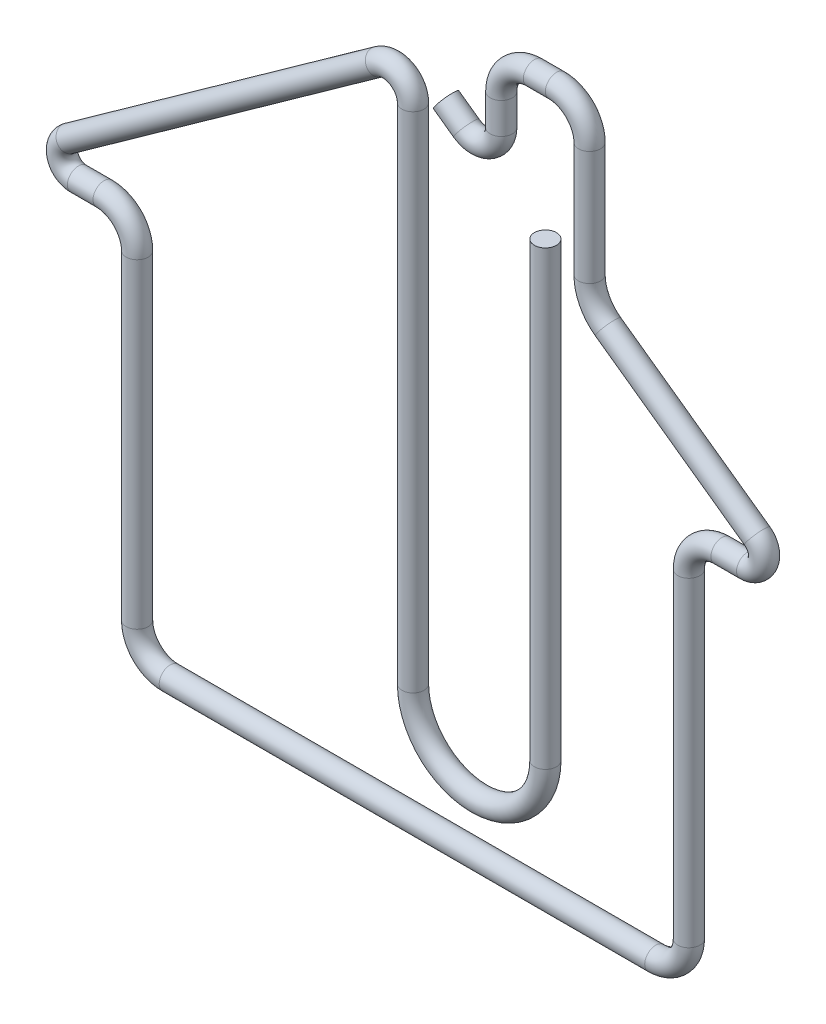
ISO-10303-21;
HEADER;
FILE_DESCRIPTION(('STEP AP214'),'2;1');
FILE_NAME('part.step','',(''),(''),'','','');
FILE_SCHEMA(('AUTOMOTIVE_DESIGN { 1 0 10303 214 1 1 1 1 }'));
ENDSEC;
DATA;
#1=APPLICATION_CONTEXT('core data for automotive mechanical design processes');
#2=APPLICATION_PROTOCOL_DEFINITION('international standard','automotive_design',2000,#1);
#3=PRODUCT_CONTEXT('',#1,'mechanical');
#4=PRODUCT('Part','Part','',(#3));
#5=PRODUCT_RELATED_PRODUCT_CATEGORY('part','',(#4));
#6=PRODUCT_DEFINITION_FORMATION('','',#4);
#7=PRODUCT_DEFINITION_CONTEXT('part definition',#1,'design');
#8=PRODUCT_DEFINITION('design','',#6,#7);
#9=PRODUCT_DEFINITION_SHAPE('','',#8);
#10=(LENGTH_UNIT() NAMED_UNIT(*) SI_UNIT(.MILLI.,.METRE.));
#11=(NAMED_UNIT(*) PLANE_ANGLE_UNIT() SI_UNIT($,.RADIAN.));
#12=(NAMED_UNIT(*) SI_UNIT($,.STERADIAN.) SOLID_ANGLE_UNIT());
#13=UNCERTAINTY_MEASURE_WITH_UNIT(LENGTH_MEASURE(1.E-05),#10,'distance_accuracy_value','');
#14=(GEOMETRIC_REPRESENTATION_CONTEXT(3) GLOBAL_UNCERTAINTY_ASSIGNED_CONTEXT((#13)) GLOBAL_UNIT_ASSIGNED_CONTEXT((#10,
#11,#12)) REPRESENTATION_CONTEXT('',''));
#15=CARTESIAN_POINT('',(0.,0.,0.));
#16=DIRECTION('',(0.,0.,1.));
#17=DIRECTION('',(1.,0.,0.));
#18=AXIS2_PLACEMENT_3D('',#15,#16,#17);
#19=CARTESIAN_POINT('',(4.83752361256181,39.0446259910273,0.));
#20=DIRECTION('',(-0.813733471206736,0.581238193719095,0.));
#21=DIRECTION('',(-0.581238193719095,-0.813733471206736,0.));
#22=AXIS2_PLACEMENT_3D('',#19,#20,#21);
#23=CYLINDRICAL_SURFACE('',#22,1.);
#24=CARTESIAN_POINT('',(4.83752361256181,39.0446259910273,0.));
#25=DIRECTION('',(-0.813733471206766,0.581238193719054,0.));
#26=DIRECTION('',(-0.581238193719054,-0.813733471206766,0.));
#27=AXIS2_PLACEMENT_3D('',#24,#25,#26);
#28=CIRCLE('',#27,1.);
#29=CARTESIAN_POINT('',(4.25628541884272,38.2308925198205,0.));
#30=VERTEX_POINT('',#29);
#31=EDGE_CURVE('E39',#30,#30,#28,.T.);
#32=ORIENTED_EDGE('',*,*,#31,.T.);
#33=EDGE_LOOP('',(#32));
#34=FACE_BOUND('',#33,.T.);
#35=CARTESIAN_POINT('',(3.00000000000001,40.3571428571428,0.));
#36=DIRECTION('',(-0.813733471206766,0.581238193719054,0.));
#37=DIRECTION('',(-0.581238193719054,-0.813733471206766,0.));
#38=AXIS2_PLACEMENT_3D('',#35,#36,#37);
#39=CIRCLE('',#38,1.);
#40=CARTESIAN_POINT('',(2.41876180628095,39.5434093859361,0.));
#41=VERTEX_POINT('',#40);
#42=EDGE_CURVE('E10',#41,#41,#39,.T.);
#43=ORIENTED_EDGE('',*,*,#42,.F.);
#44=EDGE_LOOP('',(#43));
#45=FACE_BOUND('',#44,.T.);
#46=ADVANCED_FACE('F33',(#34,#45),#23,.T.);
#47=CARTESIAN_POINT('',(6.,40.6720929334408,0.));
#48=DIRECTION('',(0.,0.,-1.));
#49=DIRECTION('',(-1.,0.,0.));
#50=AXIS2_PLACEMENT_3D('',#47,#48,#49);
#51=TOROIDAL_SURFACE('',#50,2.00000000000001,1.);
#52=CARTESIAN_POINT('',(8.00000000000001,40.6720929334408,0.));
#53=DIRECTION('',(0.,-1.,0.));
#54=DIRECTION('',(1.,0.,0.));
#55=AXIS2_PLACEMENT_3D('',#52,#53,#54);
#56=CIRCLE('',#55,1.);
#57=CARTESIAN_POINT('',(9.00000000000001,40.6720929334408,0.));
#58=VERTEX_POINT('',#57);
#59=EDGE_CURVE('E43',#58,#58,#56,.T.);
#60=CARTESIAN_POINT('',(6.,40.6720929334408,0.));
#61=DIRECTION('',(0.,0.,-1.));
#62=DIRECTION('',(-1.,0.,0.));
#63=AXIS2_PLACEMENT_3D('',#60,#61,#62);
#64=CIRCLE('',#63,3.00000000000001);
#65=EDGE_CURVE('',#58,#30,#64,.T.);
#66=ORIENTED_EDGE('',*,*,#59,.T.);
#67=ORIENTED_EDGE('',*,*,#31,.F.);
#68=ORIENTED_EDGE('',*,*,#65,.T.);
#69=ORIENTED_EDGE('',*,*,#65,.F.);
#70=EDGE_LOOP('',(#66,#68,#67,#69));
#71=FACE_BOUND('',#70,.T.);
#72=ADVANCED_FACE('F137',(#71),#51,.T.);
#73=CARTESIAN_POINT('',(8.00000000000001,43.5,0.));
#74=DIRECTION('',(0.,-1.,0.));
#75=DIRECTION('',(1.,0.,0.));
#76=AXIS2_PLACEMENT_3D('',#73,#74,#75);
#77=CYLINDRICAL_SURFACE('',#76,1.);
#78=CARTESIAN_POINT('',(8.00000000000001,43.5,0.));
#79=DIRECTION('',(0.,-1.,0.));
#80=DIRECTION('',(1.,0.,0.));
#81=AXIS2_PLACEMENT_3D('',#78,#79,#80);
#82=CIRCLE('',#81,1.);
#83=CARTESIAN_POINT('',(7.00000000000001,43.5,0.));
#84=VERTEX_POINT('',#83);
#85=EDGE_CURVE('E47',#84,#84,#82,.T.);
#86=ORIENTED_EDGE('',*,*,#85,.T.);
#87=EDGE_LOOP('',(#86));
#88=FACE_BOUND('',#87,.T.);
#89=ORIENTED_EDGE('',*,*,#59,.F.);
#90=EDGE_LOOP('',(#89));
#91=FACE_BOUND('',#90,.T.);
#92=ADVANCED_FACE('F141',(#88,#91),#77,.T.);
#93=CARTESIAN_POINT('',(11.,43.5,0.));
#94=DIRECTION('',(0.,0.,1.));
#95=DIRECTION('',(1.,0.,0.));
#96=AXIS2_PLACEMENT_3D('',#93,#94,#95);
#97=TOROIDAL_SURFACE('',#96,2.99999999999999,1.);
#98=CARTESIAN_POINT('',(11.,46.5,0.));
#99=DIRECTION('',(-1.,0.,0.));
#100=DIRECTION('',(0.,-1.,0.));
#101=AXIS2_PLACEMENT_3D('',#98,#99,#100);
#102=CIRCLE('',#101,1.);
#103=CARTESIAN_POINT('',(11.,47.5,0.));
#104=VERTEX_POINT('',#103);
#105=EDGE_CURVE('E52',#104,#104,#102,.T.);
#106=CARTESIAN_POINT('',(11.,43.5,0.));
#107=DIRECTION('',(0.,0.,1.));
#108=DIRECTION('',(1.,0.,0.));
#109=AXIS2_PLACEMENT_3D('',#106,#107,#108);
#110=CIRCLE('',#109,3.99999999999999);
#111=EDGE_CURVE('',#104,#84,#110,.T.);
#112=ORIENTED_EDGE('',*,*,#105,.T.);
#113=ORIENTED_EDGE('',*,*,#85,.F.);
#114=ORIENTED_EDGE('',*,*,#111,.T.);
#115=ORIENTED_EDGE('',*,*,#111,.F.);
#116=EDGE_LOOP('',(#112,#114,#113,#115));
#117=FACE_BOUND('',#116,.T.);
#118=ADVANCED_FACE('F147',(#117),#97,.T.);
#119=CARTESIAN_POINT('',(13.,46.5,0.));
#120=DIRECTION('',(-1.,0.,0.));
#121=DIRECTION('',(0.,0.,1.));
#122=AXIS2_PLACEMENT_3D('',#119,#120,#121);
#123=CYLINDRICAL_SURFACE('',#122,1.);
#124=CARTESIAN_POINT('',(13.,46.5,0.));
#125=DIRECTION('',(-1.,0.,0.));
#126=DIRECTION('',(0.,-1.,0.));
#127=AXIS2_PLACEMENT_3D('',#124,#125,#126);
#128=CIRCLE('',#127,1.);
#129=CARTESIAN_POINT('',(13.,47.5,0.));
#130=VERTEX_POINT('',#129);
#131=EDGE_CURVE('E55',#130,#130,#128,.T.);
#132=ORIENTED_EDGE('',*,*,#131,.T.);
#133=EDGE_LOOP('',(#132));
#134=FACE_BOUND('',#133,.T.);
#135=ORIENTED_EDGE('',*,*,#105,.F.);
#136=EDGE_LOOP('',(#135));
#137=FACE_BOUND('',#136,.T.);
#138=ADVANCED_FACE('F154',(#134,#137),#123,.T.);
#139=CARTESIAN_POINT('',(13.,43.5,0.));
#140=DIRECTION('',(0.,0.,1.));
#141=DIRECTION('',(1.,0.,0.));
#142=AXIS2_PLACEMENT_3D('',#139,#140,#141);
#143=TOROIDAL_SURFACE('',#142,2.99999999999999,1.);
#144=CARTESIAN_POINT('',(16.,43.5,0.));
#145=DIRECTION('',(0.,1.,0.));
#146=DIRECTION('',(-1.,0.,0.));
#147=AXIS2_PLACEMENT_3D('',#144,#145,#146);
#148=CIRCLE('',#147,1.);
#149=CARTESIAN_POINT('',(17.,43.5,0.));
#150=VERTEX_POINT('',#149);
#151=EDGE_CURVE('E58',#150,#150,#148,.T.);
#152=CARTESIAN_POINT('',(13.,43.5,0.));
#153=DIRECTION('',(0.,0.,1.));
#154=DIRECTION('',(1.,0.,0.));
#155=AXIS2_PLACEMENT_3D('',#152,#153,#154);
#156=CIRCLE('',#155,3.99999999999999);
#157=EDGE_CURVE('',#150,#130,#156,.T.);
#158=ORIENTED_EDGE('',*,*,#151,.T.);
#159=ORIENTED_EDGE('',*,*,#131,.F.);
#160=ORIENTED_EDGE('',*,*,#157,.T.);
#161=ORIENTED_EDGE('',*,*,#157,.F.);
#162=EDGE_LOOP('',(#158,#160,#159,#161));
#163=FACE_BOUND('',#162,.T.);
#164=ADVANCED_FACE('F158',(#163),#143,.T.);
#165=CARTESIAN_POINT('',(16.,33.1299001525958,0.));
#166=DIRECTION('',(0.,1.,0.));
#167=DIRECTION('',(0.,0.,1.));
#168=AXIS2_PLACEMENT_3D('',#165,#166,#167);
#169=CYLINDRICAL_SURFACE('',#168,1.);
#170=CARTESIAN_POINT('',(16.,33.1299001525958,0.));
#171=DIRECTION('',(0.,1.,0.));
#172=DIRECTION('',(-1.,0.,0.));
#173=AXIS2_PLACEMENT_3D('',#170,#171,#172);
#174=CIRCLE('',#173,1.);
#175=CARTESIAN_POINT('',(15.,33.1299001525958,0.));
#176=VERTEX_POINT('',#175);
#177=EDGE_CURVE('E61',#176,#176,#174,.T.);
#178=ORIENTED_EDGE('',*,*,#177,.T.);
#179=EDGE_LOOP('',(#178));
#180=FACE_BOUND('',#179,.T.);
#181=ORIENTED_EDGE('',*,*,#151,.F.);
#182=EDGE_LOOP('',(#181));
#183=FACE_BOUND('',#182,.T.);
#184=ADVANCED_FACE('F162',(#180,#183),#169,.T.);
#185=CARTESIAN_POINT('',(20.,33.1299001525958,0.));
#186=DIRECTION('',(0.,0.,-1.));
#187=DIRECTION('',(-1.,0.,0.));
#188=AXIS2_PLACEMENT_3D('',#185,#186,#187);
#189=TOROIDAL_SURFACE('',#188,4.00000000000001,1.);
#190=CARTESIAN_POINT('',(17.6750472251236,29.8749662677688,0.));
#191=DIRECTION('',(-0.813733471206755,0.581238193719069,0.));
#192=DIRECTION('',(-0.581238193719069,-0.813733471206755,0.));
#193=AXIS2_PLACEMENT_3D('',#190,#191,#192);
#194=CIRCLE('',#193,1.);
#195=CARTESIAN_POINT('',(17.0938090314045,29.0612327965621,0.));
#196=VERTEX_POINT('',#195);
#197=EDGE_CURVE('E64',#196,#196,#194,.T.);
#198=CARTESIAN_POINT('',(20.,33.1299001525958,0.));
#199=DIRECTION('',(0.,0.,-1.));
#200=DIRECTION('',(-1.,0.,0.));
#201=AXIS2_PLACEMENT_3D('',#198,#199,#200);
#202=CIRCLE('',#201,5.00000000000001);
#203=EDGE_CURVE('',#196,#176,#202,.T.);
#204=ORIENTED_EDGE('',*,*,#197,.T.);
#205=ORIENTED_EDGE('',*,*,#177,.F.);
#206=ORIENTED_EDGE('',*,*,#203,.T.);
#207=ORIENTED_EDGE('',*,*,#203,.F.);
#208=EDGE_LOOP('',(#204,#206,#205,#207));
#209=FACE_BOUND('',#208,.T.);
#210=ADVANCED_FACE('F166',(#209),#189,.T.);
#211=CARTESIAN_POINT('',(31.1911597104659,20.2206002068101,0.));
#212=DIRECTION('',(-0.813733471206735,0.581238193719096,0.));
#213=DIRECTION('',(-0.581238193719096,-0.813733471206735,0.));
#214=AXIS2_PLACEMENT_3D('',#211,#212,#213);
#215=CYLINDRICAL_SURFACE('',#214,1.);
#216=CARTESIAN_POINT('',(31.1911597104659,20.2206002068101,0.));
#217=DIRECTION('',(-0.813733471206755,0.581238193719069,0.));
#218=DIRECTION('',(-0.581238193719069,-0.813733471206755,0.));
#219=AXIS2_PLACEMENT_3D('',#216,#217,#218);
#220=CIRCLE('',#219,1.);
#221=CARTESIAN_POINT('',(31.7723979041849,21.0343336780168,0.));
#222=VERTEX_POINT('',#221);
#223=EDGE_CURVE('E67',#222,#222,#220,.T.);
#224=ORIENTED_EDGE('',*,*,#223,.T.);
#225=EDGE_LOOP('',(#224));
#226=FACE_BOUND('',#225,.T.);
#227=ORIENTED_EDGE('',*,*,#197,.F.);
#228=EDGE_LOOP('',(#227));
#229=FACE_BOUND('',#228,.T.);
#230=ADVANCED_FACE('F170',(#226,#229),#215,.T.);
#231=CARTESIAN_POINT('',(30.3193024198872,19.,0.));
#232=DIRECTION('',(0.,0.,1.));
#233=DIRECTION('',(1.,0.,0.));
#234=AXIS2_PLACEMENT_3D('',#231,#232,#233);
#235=TOROIDAL_SURFACE('',#234,1.49999999999999,1.);
#236=CARTESIAN_POINT('',(30.3193024198872,17.5,0.));
#237=DIRECTION('',(1.,0.,0.));
#238=DIRECTION('',(0.,1.,0.));
#239=AXIS2_PLACEMENT_3D('',#236,#237,#238);
#240=CIRCLE('',#239,1.);
#241=CARTESIAN_POINT('',(30.3193024198872,16.5,0.));
#242=VERTEX_POINT('',#241);
#243=EDGE_CURVE('E70',#242,#242,#240,.T.);
#244=CARTESIAN_POINT('',(30.3193024198872,19.,0.));
#245=DIRECTION('',(0.,0.,1.));
#246=DIRECTION('',(1.,0.,0.));
#247=AXIS2_PLACEMENT_3D('',#244,#245,#246);
#248=CIRCLE('',#247,2.49999999999999);
#249=EDGE_CURVE('',#242,#222,#248,.T.);
#250=ORIENTED_EDGE('',*,*,#243,.T.);
#251=ORIENTED_EDGE('',*,*,#223,.F.);
#252=ORIENTED_EDGE('',*,*,#249,.T.);
#253=ORIENTED_EDGE('',*,*,#249,.F.);
#254=EDGE_LOOP('',(#250,#252,#251,#253));
#255=FACE_BOUND('',#254,.T.);
#256=ADVANCED_FACE('F174',(#255),#235,.T.);
#257=CARTESIAN_POINT('',(28.,17.5,0.));
#258=DIRECTION('',(1.,0.,0.));
#259=DIRECTION('',(0.,1.,0.));
#260=AXIS2_PLACEMENT_3D('',#257,#258,#259);
#261=CYLINDRICAL_SURFACE('',#260,1.);
#262=CARTESIAN_POINT('',(28.,17.5,0.));
#263=DIRECTION('',(1.,0.,0.));
#264=DIRECTION('',(0.,1.,0.));
#265=AXIS2_PLACEMENT_3D('',#262,#263,#264);
#266=CIRCLE('',#265,1.);
#267=CARTESIAN_POINT('',(28.,18.5,0.));
#268=VERTEX_POINT('',#267);
#269=EDGE_CURVE('E73',#268,#268,#266,.T.);
#270=ORIENTED_EDGE('',*,*,#269,.T.);
#271=EDGE_LOOP('',(#270));
#272=FACE_BOUND('',#271,.T.);
#273=ORIENTED_EDGE('',*,*,#243,.F.);
#274=EDGE_LOOP('',(#273));
#275=FACE_BOUND('',#274,.T.);
#276=ADVANCED_FACE('F178',(#272,#275),#261,.T.);
#277=CARTESIAN_POINT('',(28.,14.5,0.));
#278=DIRECTION('',(0.,0.,-1.));
#279=DIRECTION('',(-1.,0.,0.));
#280=AXIS2_PLACEMENT_3D('',#277,#278,#279);
#281=TOROIDAL_SURFACE('',#280,3.00000000000001,1.);
#282=CARTESIAN_POINT('',(25.,14.5,0.));
#283=DIRECTION('',(0.,1.,0.));
#284=DIRECTION('',(-1.,0.,0.));
#285=AXIS2_PLACEMENT_3D('',#282,#283,#284);
#286=CIRCLE('',#285,1.);
#287=CARTESIAN_POINT('',(24.,14.5,0.));
#288=VERTEX_POINT('',#287);
#289=EDGE_CURVE('E76',#288,#288,#286,.T.);
#290=CARTESIAN_POINT('',(28.,14.5,0.));
#291=DIRECTION('',(0.,0.,-1.));
#292=DIRECTION('',(-1.,0.,0.));
#293=AXIS2_PLACEMENT_3D('',#290,#291,#292);
#294=CIRCLE('',#293,4.00000000000001);
#295=EDGE_CURVE('',#288,#268,#294,.T.);
#296=ORIENTED_EDGE('',*,*,#289,.T.);
#297=ORIENTED_EDGE('',*,*,#269,.F.);
#298=ORIENTED_EDGE('',*,*,#295,.T.);
#299=ORIENTED_EDGE('',*,*,#295,.F.);
#300=EDGE_LOOP('',(#296,#298,#297,#299));
#301=FACE_BOUND('',#300,.T.);
#302=ADVANCED_FACE('F182',(#301),#281,.T.);
#303=CARTESIAN_POINT('',(25.,-14.5,0.));
#304=DIRECTION('',(0.,1.,0.));
#305=DIRECTION('',(0.,0.,1.));
#306=AXIS2_PLACEMENT_3D('',#303,#304,#305);
#307=CYLINDRICAL_SURFACE('',#306,1.);
#308=CARTESIAN_POINT('',(25.,-14.5,0.));
#309=DIRECTION('',(0.,1.,0.));
#310=DIRECTION('',(-1.,0.,0.));
#311=AXIS2_PLACEMENT_3D('',#308,#309,#310);
#312=CIRCLE('',#311,1.);
#313=CARTESIAN_POINT('',(26.,-14.5,0.));
#314=VERTEX_POINT('',#313);
#315=EDGE_CURVE('E79',#314,#314,#312,.T.);
#316=ORIENTED_EDGE('',*,*,#315,.T.);
#317=EDGE_LOOP('',(#316));
#318=FACE_BOUND('',#317,.T.);
#319=ORIENTED_EDGE('',*,*,#289,.F.);
#320=EDGE_LOOP('',(#319));
#321=FACE_BOUND('',#320,.T.);
#322=ADVANCED_FACE('F186',(#318,#321),#307,.T.);
#323=CARTESIAN_POINT('',(22.,-14.5,0.));
#324=DIRECTION('',(0.,0.,1.));
#325=DIRECTION('',(1.,0.,0.));
#326=AXIS2_PLACEMENT_3D('',#323,#324,#325);
#327=TOROIDAL_SURFACE('',#326,2.99999999999999,1.);
#328=CARTESIAN_POINT('',(22.,-17.5,0.));
#329=DIRECTION('',(1.,0.,0.));
#330=DIRECTION('',(0.,1.,0.));
#331=AXIS2_PLACEMENT_3D('',#328,#329,#330);
#332=CIRCLE('',#331,1.);
#333=CARTESIAN_POINT('',(22.,-18.5,0.));
#334=VERTEX_POINT('',#333);
#335=EDGE_CURVE('E82',#334,#334,#332,.T.);
#336=CARTESIAN_POINT('',(22.,-14.5,0.));
#337=DIRECTION('',(0.,0.,1.));
#338=DIRECTION('',(1.,0.,0.));
#339=AXIS2_PLACEMENT_3D('',#336,#337,#338);
#340=CIRCLE('',#339,3.99999999999999);
#341=EDGE_CURVE('',#334,#314,#340,.T.);
#342=ORIENTED_EDGE('',*,*,#335,.T.);
#343=ORIENTED_EDGE('',*,*,#315,.F.);
#344=ORIENTED_EDGE('',*,*,#341,.T.);
#345=ORIENTED_EDGE('',*,*,#341,.F.);
#346=EDGE_LOOP('',(#342,#344,#343,#345));
#347=FACE_BOUND('',#346,.T.);
#348=ADVANCED_FACE('F190',(#347),#327,.T.);
#349=CARTESIAN_POINT('',(-22.,-17.5,0.));
#350=DIRECTION('',(1.,0.,0.));
#351=DIRECTION('',(0.,0.,-1.));
#352=AXIS2_PLACEMENT_3D('',#349,#350,#351);
#353=CYLINDRICAL_SURFACE('',#352,1.);
#354=CARTESIAN_POINT('',(-22.,-17.5,0.));
#355=DIRECTION('',(1.,0.,0.));
#356=DIRECTION('',(0.,1.,0.));
#357=AXIS2_PLACEMENT_3D('',#354,#355,#356);
#358=CIRCLE('',#357,1.);
#359=CARTESIAN_POINT('',(-22.,-18.5,0.));
#360=VERTEX_POINT('',#359);
#361=EDGE_CURVE('E85',#360,#360,#358,.T.);
#362=ORIENTED_EDGE('',*,*,#361,.T.);
#363=EDGE_LOOP('',(#362));
#364=FACE_BOUND('',#363,.T.);
#365=ORIENTED_EDGE('',*,*,#335,.F.);
#366=EDGE_LOOP('',(#365));
#367=FACE_BOUND('',#366,.T.);
#368=ADVANCED_FACE('F194',(#364,#367),#353,.T.);
#369=CARTESIAN_POINT('',(-22.,-14.5,0.));
#370=DIRECTION('',(0.,0.,1.));
#371=DIRECTION('',(1.,0.,0.));
#372=AXIS2_PLACEMENT_3D('',#369,#370,#371);
#373=TOROIDAL_SURFACE('',#372,2.99999999999999,1.);
#374=CARTESIAN_POINT('',(-25.,-14.5,0.));
#375=DIRECTION('',(0.,-1.,0.));
#376=DIRECTION('',(1.,0.,0.));
#377=AXIS2_PLACEMENT_3D('',#374,#375,#376);
#378=CIRCLE('',#377,1.);
#379=CARTESIAN_POINT('',(-26.,-14.5,0.));
#380=VERTEX_POINT('',#379);
#381=EDGE_CURVE('E88',#380,#380,#378,.T.);
#382=CARTESIAN_POINT('',(-22.,-14.5,0.));
#383=DIRECTION('',(0.,0.,1.));
#384=DIRECTION('',(1.,0.,0.));
#385=AXIS2_PLACEMENT_3D('',#382,#383,#384);
#386=CIRCLE('',#385,3.99999999999999);
#387=EDGE_CURVE('',#380,#360,#386,.T.);
#388=ORIENTED_EDGE('',*,*,#381,.T.);
#389=ORIENTED_EDGE('',*,*,#361,.F.);
#390=ORIENTED_EDGE('',*,*,#387,.T.);
#391=ORIENTED_EDGE('',*,*,#387,.F.);
#392=EDGE_LOOP('',(#388,#390,#389,#391));
#393=FACE_BOUND('',#392,.T.);
#394=ADVANCED_FACE('F198',(#393),#373,.T.);
#395=CARTESIAN_POINT('',(-25.,14.5,0.));
#396=DIRECTION('',(0.,-1.,0.));
#397=DIRECTION('',(0.,0.,-1.));
#398=AXIS2_PLACEMENT_3D('',#395,#396,#397);
#399=CYLINDRICAL_SURFACE('',#398,1.);
#400=CARTESIAN_POINT('',(-25.,14.5,0.));
#401=DIRECTION('',(0.,-1.,0.));
#402=DIRECTION('',(1.,0.,0.));
#403=AXIS2_PLACEMENT_3D('',#400,#401,#402);
#404=CIRCLE('',#403,1.);
#405=CARTESIAN_POINT('',(-24.,14.5,0.));
#406=VERTEX_POINT('',#405);
#407=EDGE_CURVE('E91',#406,#406,#404,.T.);
#408=ORIENTED_EDGE('',*,*,#407,.T.);
#409=EDGE_LOOP('',(#408));
#410=FACE_BOUND('',#409,.T.);
#411=ORIENTED_EDGE('',*,*,#381,.F.);
#412=EDGE_LOOP('',(#411));
#413=FACE_BOUND('',#412,.T.);
#414=ADVANCED_FACE('F202',(#410,#413),#399,.T.);
#415=CARTESIAN_POINT('',(-28.,14.5,0.));
#416=DIRECTION('',(0.,0.,-1.));
#417=DIRECTION('',(-1.,0.,0.));
#418=AXIS2_PLACEMENT_3D('',#415,#416,#417);
#419=TOROIDAL_SURFACE('',#418,3.00000000000001,1.);
#420=CARTESIAN_POINT('',(-28.,17.5,0.));
#421=DIRECTION('',(1.,0.,0.));
#422=DIRECTION('',(0.,1.,0.));
#423=AXIS2_PLACEMENT_3D('',#420,#421,#422);
#424=CIRCLE('',#423,1.);
#425=CARTESIAN_POINT('',(-28.,18.5,0.));
#426=VERTEX_POINT('',#425);
#427=EDGE_CURVE('E94',#426,#426,#424,.T.);
#428=CARTESIAN_POINT('',(-28.,14.5,0.));
#429=DIRECTION('',(0.,0.,-1.));
#430=DIRECTION('',(-1.,0.,0.));
#431=AXIS2_PLACEMENT_3D('',#428,#429,#430);
#432=CIRCLE('',#431,4.00000000000001);
#433=EDGE_CURVE('',#426,#406,#432,.T.);
#434=ORIENTED_EDGE('',*,*,#427,.T.);
#435=ORIENTED_EDGE('',*,*,#407,.F.);
#436=ORIENTED_EDGE('',*,*,#433,.T.);
#437=ORIENTED_EDGE('',*,*,#433,.F.);
#438=EDGE_LOOP('',(#434,#436,#435,#437));
#439=FACE_BOUND('',#438,.T.);
#440=ADVANCED_FACE('F206',(#439),#419,.T.);
#441=CARTESIAN_POINT('',(-30.3193024198872,17.5,0.));
#442=DIRECTION('',(1.,0.,0.));
#443=DIRECTION('',(0.,1.,0.));
#444=AXIS2_PLACEMENT_3D('',#441,#442,#443);
#445=CYLINDRICAL_SURFACE('',#444,1.);
#446=CARTESIAN_POINT('',(-30.3193024198872,17.5,0.));
#447=DIRECTION('',(1.,0.,0.));
#448=DIRECTION('',(0.,1.,0.));
#449=AXIS2_PLACEMENT_3D('',#446,#447,#448);
#450=CIRCLE('',#449,1.);
#451=CARTESIAN_POINT('',(-30.3193024198872,16.5,0.));
#452=VERTEX_POINT('',#451);
#453=EDGE_CURVE('E97',#452,#452,#450,.T.);
#454=ORIENTED_EDGE('',*,*,#453,.T.);
#455=EDGE_LOOP('',(#454));
#456=FACE_BOUND('',#455,.T.);
#457=ORIENTED_EDGE('',*,*,#427,.F.);
#458=EDGE_LOOP('',(#457));
#459=FACE_BOUND('',#458,.T.);
#460=ADVANCED_FACE('F210',(#456,#459),#445,.T.);
#461=CARTESIAN_POINT('',(-30.3193024198872,19.,0.));
#462=DIRECTION('',(0.,0.,1.));
#463=DIRECTION('',(1.,0.,0.));
#464=AXIS2_PLACEMENT_3D('',#461,#462,#463);
#465=TOROIDAL_SURFACE('',#464,1.49999999999999,1.);
#466=CARTESIAN_POINT('',(-31.1911597104658,20.2206002068101,0.));
#467=DIRECTION('',(-0.813733471206716,-0.581238193719123,0.));
#468=DIRECTION('',(0.581238193719123,-0.813733471206716,0.));
#469=AXIS2_PLACEMENT_3D('',#466,#467,#468);
#470=CIRCLE('',#469,1.);
#471=CARTESIAN_POINT('',(-31.7723979041849,21.0343336780168,0.));
#472=VERTEX_POINT('',#471);
#473=EDGE_CURVE('E100',#472,#472,#470,.T.);
#474=CARTESIAN_POINT('',(-30.3193024198872,19.,0.));
#475=DIRECTION('',(0.,0.,1.));
#476=DIRECTION('',(1.,0.,0.));
#477=AXIS2_PLACEMENT_3D('',#474,#475,#476);
#478=CIRCLE('',#477,2.49999999999999);
#479=EDGE_CURVE('',#472,#452,#478,.T.);
#480=ORIENTED_EDGE('',*,*,#473,.T.);
#481=ORIENTED_EDGE('',*,*,#453,.F.);
#482=ORIENTED_EDGE('',*,*,#479,.T.);
#483=ORIENTED_EDGE('',*,*,#479,.F.);
#484=EDGE_LOOP('',(#480,#482,#481,#483));
#485=FACE_BOUND('',#484,.T.);
#486=ADVANCED_FACE('F214',(#485),#465,.T.);
#487=CARTESIAN_POINT('',(-3.16247638743822,40.241088294687,0.));
#488=DIRECTION('',(-0.813733471206735,-0.581238193719097,0.));
#489=DIRECTION('',(0.581238193719097,-0.813733471206735,0.));
#490=AXIS2_PLACEMENT_3D('',#487,#488,#489);
#491=CYLINDRICAL_SURFACE('',#490,1.);
#492=CARTESIAN_POINT('',(-3.16247638743822,40.241088294687,0.));
#493=DIRECTION('',(-0.813733471206716,-0.581238193719123,0.));
#494=DIRECTION('',(0.581238193719123,-0.813733471206716,0.));
#495=AXIS2_PLACEMENT_3D('',#492,#493,#494);
#496=CIRCLE('',#495,1.);
#497=CARTESIAN_POINT('',(-3.74371458115734,41.0548217658937,0.));
#498=VERTEX_POINT('',#497);
#499=EDGE_CURVE('E103',#498,#498,#496,.T.);
#500=ORIENTED_EDGE('',*,*,#499,.T.);
#501=EDGE_LOOP('',(#500));
#502=FACE_BOUND('',#501,.T.);
#503=ORIENTED_EDGE('',*,*,#473,.F.);
#504=EDGE_LOOP('',(#503));
#505=FACE_BOUND('',#504,.T.);
#506=ADVANCED_FACE('F218',(#502,#505),#491,.T.);
#507=CARTESIAN_POINT('',(-2.,38.6136213522735,0.));
#508=DIRECTION('',(0.,0.,1.));
#509=DIRECTION('',(1.,0.,0.));
#510=AXIS2_PLACEMENT_3D('',#507,#508,#509);
#511=TOROIDAL_SURFACE('',#510,2.,1.);
#512=CARTESIAN_POINT('',(0.,38.6136213522735,0.));
#513=DIRECTION('',(0.,1.,0.));
#514=DIRECTION('',(-1.,0.,0.));
#515=AXIS2_PLACEMENT_3D('',#512,#513,#514);
#516=CIRCLE('',#515,1.);
#517=CARTESIAN_POINT('',(1.,38.6136213522735,0.));
#518=VERTEX_POINT('',#517);
#519=EDGE_CURVE('E106',#518,#518,#516,.T.);
#520=CARTESIAN_POINT('',(-2.,38.6136213522735,0.));
#521=DIRECTION('',(0.,0.,1.));
#522=DIRECTION('',(1.,0.,0.));
#523=AXIS2_PLACEMENT_3D('',#520,#521,#522);
#524=CIRCLE('',#523,3.);
#525=EDGE_CURVE('',#518,#498,#524,.T.);
#526=ORIENTED_EDGE('',*,*,#519,.T.);
#527=ORIENTED_EDGE('',*,*,#499,.F.);
#528=ORIENTED_EDGE('',*,*,#525,.T.);
#529=ORIENTED_EDGE('',*,*,#525,.F.);
#530=EDGE_LOOP('',(#526,#528,#527,#529));
#531=FACE_BOUND('',#530,.T.);
#532=ADVANCED_FACE('F222',(#531),#511,.T.);
#533=CARTESIAN_POINT('',(0.,-7.00000000000001,0.));
#534=DIRECTION('',(0.,1.,0.));
#535=DIRECTION('',(-1.,0.,0.));
#536=AXIS2_PLACEMENT_3D('',#533,#534,#535);
#537=CYLINDRICAL_SURFACE('',#536,1.);
#538=CARTESIAN_POINT('',(0.,-7.00000000000001,0.));
#539=DIRECTION('',(0.,1.,0.));
#540=DIRECTION('',(-1.,0.,0.));
#541=AXIS2_PLACEMENT_3D('',#538,#539,#540);
#542=CIRCLE('',#541,1.);
#543=CARTESIAN_POINT('',(-0.999999999999997,-7.00000000000001,0.));
#544=VERTEX_POINT('',#543);
#545=EDGE_CURVE('E109',#544,#544,#542,.T.);
#546=ORIENTED_EDGE('',*,*,#545,.T.);
#547=EDGE_LOOP('',(#546));
#548=FACE_BOUND('',#547,.T.);
#549=ORIENTED_EDGE('',*,*,#519,.F.);
#550=EDGE_LOOP('',(#549));
#551=FACE_BOUND('',#550,.T.);
#552=ADVANCED_FACE('F226',(#548,#551),#537,.T.);
#553=CARTESIAN_POINT('',(6.,-7.00000000000001,0.));
#554=DIRECTION('',(0.,0.,-1.));
#555=DIRECTION('',(-1.,0.,0.));
#556=AXIS2_PLACEMENT_3D('',#553,#554,#555);
#557=TOROIDAL_SURFACE('',#556,6.,1.);
#558=CARTESIAN_POINT('',(12.,-7.00000000000001,0.));
#559=DIRECTION('',(0.,-1.,0.));
#560=DIRECTION('',(1.,0.,0.));
#561=AXIS2_PLACEMENT_3D('',#558,#559,#560);
#562=CIRCLE('',#561,1.);
#563=CARTESIAN_POINT('',(13.,-7.00000000000001,0.));
#564=VERTEX_POINT('',#563);
#565=EDGE_CURVE('E112',#564,#564,#562,.T.);
#566=CARTESIAN_POINT('',(6.,-7.00000000000001,0.));
#567=DIRECTION('',(0.,0.,-1.));
#568=DIRECTION('',(-1.,0.,0.));
#569=AXIS2_PLACEMENT_3D('',#566,#567,#568);
#570=CIRCLE('',#569,7.);
#571=EDGE_CURVE('',#564,#544,#570,.T.);
#572=ORIENTED_EDGE('',*,*,#565,.T.);
#573=ORIENTED_EDGE('',*,*,#545,.F.);
#574=ORIENTED_EDGE('',*,*,#571,.T.);
#575=ORIENTED_EDGE('',*,*,#571,.F.);
#576=EDGE_LOOP('',(#572,#574,#573,#575));
#577=FACE_BOUND('',#576,.T.);
#578=ADVANCED_FACE('F119',(#577),#557,.T.);
#579=CARTESIAN_POINT('',(12.,-7.00000000000001,0.));
#580=DIRECTION('',(0.,1.,0.));
#581=DIRECTION('',(-1.,0.,0.));
#582=AXIS2_PLACEMENT_3D('',#579,#580,#581);
#583=CYLINDRICAL_SURFACE('',#582,1.);
#584=ORIENTED_EDGE('',*,*,#565,.F.);
#585=EDGE_LOOP('',(#584));
#586=FACE_BOUND('',#585,.T.);
#587=CARTESIAN_POINT('',(12.,33.9285714285714,0.));
#588=DIRECTION('',(0.,-1.,0.));
#589=DIRECTION('',(1.,0.,0.));
#590=AXIS2_PLACEMENT_3D('',#587,#588,#589);
#591=CIRCLE('',#590,1.);
#592=CARTESIAN_POINT('',(13.,33.9285714285714,0.));
#593=VERTEX_POINT('',#592);
#594=EDGE_CURVE('E113',#593,#593,#591,.T.);
#595=ORIENTED_EDGE('',*,*,#594,.T.);
#596=EDGE_LOOP('',(#595));
#597=FACE_BOUND('',#596,.T.);
#598=ADVANCED_FACE('F122',(#586,#597),#583,.T.);
#599=CARTESIAN_POINT('',(3.00000000000001,40.3571428571428,0.));
#600=DIRECTION('',(-0.813733471206766,0.581238193719054,0.));
#601=DIRECTION('',(-0.581238193719054,-0.813733471206766,0.));
#602=AXIS2_PLACEMENT_3D('',#599,#600,#601);
#603=PLANE('',#602);
#604=ORIENTED_EDGE('',*,*,#42,.T.);
#605=EDGE_LOOP('',(#604));
#606=FACE_BOUND('',#605,.T.);
#607=ADVANCED_FACE('F125',(#606),#603,.T.);
#608=CARTESIAN_POINT('',(12.,33.9285714285714,0.));
#609=DIRECTION('',(0.,-1.,0.));
#610=DIRECTION('',(1.,0.,0.));
#611=AXIS2_PLACEMENT_3D('',#608,#609,#610);
#612=PLANE('',#611);
#613=ORIENTED_EDGE('',*,*,#594,.F.);
#614=EDGE_LOOP('',(#613));
#615=FACE_BOUND('',#614,.T.);
#616=ADVANCED_FACE('F129',(#615),#612,.F.);
#617=CLOSED_SHELL('',(#46,#72,#92,#118,#138,#164,#184,#210,#230,#256,#276,#302,#322,#348,#368,
#394,#414,#440,#460,#486,#506,#532,#552,#578,#598,#607,#616));
#618=MANIFOLD_SOLID_BREP('B2',#617);
#619=ADVANCED_BREP_SHAPE_REPRESENTATION('',(#18,#618),#14);
#620=SHAPE_DEFINITION_REPRESENTATION(#9,#619);
ENDSEC;
END-ISO-10303-21;
